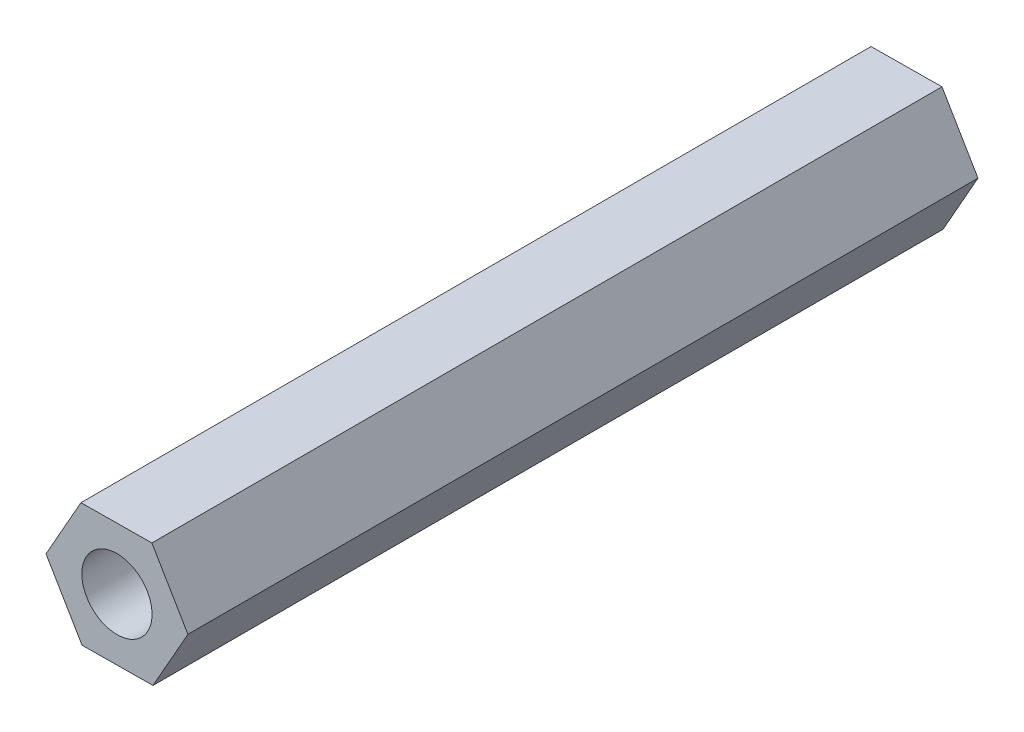
ISO-10303-21;
HEADER;
FILE_DESCRIPTION(('STEP AP214'),'2;1');
FILE_NAME('part.step','',(''),(''),'','','');
FILE_SCHEMA(('AUTOMOTIVE_DESIGN { 1 0 10303 214 1 1 1 1 }'));
ENDSEC;
DATA;
#1=APPLICATION_CONTEXT('core data for automotive mechanical design processes');
#2=APPLICATION_PROTOCOL_DEFINITION('international standard','automotive_design',2000,#1);
#3=PRODUCT_CONTEXT('',#1,'mechanical');
#4=PRODUCT('Part','Part','',(#3));
#5=PRODUCT_RELATED_PRODUCT_CATEGORY('part','',(#4));
#6=PRODUCT_DEFINITION_FORMATION('','',#4);
#7=PRODUCT_DEFINITION_CONTEXT('part definition',#1,'design');
#8=PRODUCT_DEFINITION('design','',#6,#7);
#9=PRODUCT_DEFINITION_SHAPE('','',#8);
#10=(LENGTH_UNIT() NAMED_UNIT(*) SI_UNIT(.MILLI.,.METRE.));
#11=(NAMED_UNIT(*) PLANE_ANGLE_UNIT() SI_UNIT($,.RADIAN.));
#12=(NAMED_UNIT(*) SI_UNIT($,.STERADIAN.) SOLID_ANGLE_UNIT());
#13=UNCERTAINTY_MEASURE_WITH_UNIT(LENGTH_MEASURE(1.E-05),#10,'distance_accuracy_value','');
#14=(GEOMETRIC_REPRESENTATION_CONTEXT(3) GLOBAL_UNCERTAINTY_ASSIGNED_CONTEXT((#13)) GLOBAL_UNIT_ASSIGNED_CONTEXT((#10,
#11,#12)) REPRESENTATION_CONTEXT('',''));
#15=CARTESIAN_POINT('',(0.,0.,0.));
#16=DIRECTION('',(0.,0.,1.));
#17=DIRECTION('',(1.,0.,0.));
#18=AXIS2_PLACEMENT_3D('',#15,#16,#17);
#19=CARTESIAN_POINT('',(0.,0.,45.));
#20=DIRECTION('',(0.,0.,1.));
#21=DIRECTION('',(1.,0.,0.));
#22=AXIS2_PLACEMENT_3D('',#19,#20,#21);
#23=PLANE('',#22);
#24=DIRECTION('',(0.999961257640527,0.00880245522430722,0.));
#25=VECTOR('',#24,1.);
#26=CARTESIAN_POINT('',(-1.98983906118775,-3.51765175136834,45.));
#27=LINE('',#26,#25);
#28=CARTESIAN_POINT('',(-1.98983906118775,-3.51765175136834,45.));
#29=VERTEX_POINT('',#28);
#30=CARTESIAN_POINT('',(2.05145624775792,-3.48207705211536,45.));
#31=VERTEX_POINT('',#30);
#32=EDGE_CURVE('E131',#29,#31,#27,.T.);
#33=ORIENTED_EDGE('',*,*,#32,.T.);
#34=DIRECTION('',(0.492357478980338,0.870393079529086,0.));
#35=VECTOR('',#34,1.);
#36=CARTESIAN_POINT('',(2.05145624775792,-3.48207705211536,45.));
#37=LINE('',#36,#35);
#38=CARTESIAN_POINT('',(4.04129530894568,0.0355746992529791,45.));
#39=VERTEX_POINT('',#38);
#40=EDGE_CURVE('E89',#31,#39,#37,.T.);
#41=ORIENTED_EDGE('',*,*,#40,.T.);
#42=DIRECTION('',(-0.507603778660189,0.861590624304779,0.));
#43=VECTOR('',#42,1.);
#44=CARTESIAN_POINT('',(4.04129530894568,0.0355746992529791,45.));
#45=LINE('',#44,#43);
#46=CARTESIAN_POINT('',(1.98983906118776,3.51765175136834,45.));
#47=VERTEX_POINT('',#46);
#48=EDGE_CURVE('E102',#39,#47,#45,.T.);
#49=ORIENTED_EDGE('',*,*,#48,.T.);
#50=DIRECTION('',(-0.999961257640527,-0.00880245522430723,0.));
#51=VECTOR('',#50,1.);
#52=CARTESIAN_POINT('',(1.98983906118776,3.51765175136834,45.));
#53=LINE('',#52,#51);
#54=CARTESIAN_POINT('',(-2.05145624775791,3.48207705211536,45.));
#55=VERTEX_POINT('',#54);
#56=EDGE_CURVE('E96',#47,#55,#53,.T.);
#57=ORIENTED_EDGE('',*,*,#56,.T.);
#58=DIRECTION('',(-0.492357478980338,-0.870393079529086,0.));
#59=VECTOR('',#58,1.);
#60=CARTESIAN_POINT('',(-2.05145624775791,3.48207705211536,45.));
#61=LINE('',#60,#59);
#62=CARTESIAN_POINT('',(-4.04129530894568,-0.0355746992529825,45.));
#63=VERTEX_POINT('',#62);
#64=EDGE_CURVE('E100',#55,#63,#61,.T.);
#65=ORIENTED_EDGE('',*,*,#64,.T.);
#66=DIRECTION('',(0.507603778660189,-0.861590624304779,0.));
#67=VECTOR('',#66,1.);
#68=CARTESIAN_POINT('',(-4.04129530894568,-0.0355746992529825,45.));
#69=LINE('',#68,#67);
#70=EDGE_CURVE('E52',#63,#29,#69,.T.);
#71=ORIENTED_EDGE('',*,*,#70,.T.);
#72=EDGE_LOOP('',(#33,#41,#49,#57,#65,#71));
#73=FACE_BOUND('',#72,.T.);
#74=CARTESIAN_POINT('',(0.,0.,45.));
#75=DIRECTION('',(0.,0.,1.));
#76=DIRECTION('',(1.,0.,0.));
#77=AXIS2_PLACEMENT_3D('',#74,#75,#76);
#78=CIRCLE('',#77,2.);
#79=CARTESIAN_POINT('',(-2.,0.,45.));
#80=VERTEX_POINT('',#79);
#81=EDGE_CURVE('E124',#80,#80,#78,.T.);
#82=ORIENTED_EDGE('',*,*,#81,.F.);
#83=EDGE_LOOP('',(#82));
#84=FACE_BOUND('',#83,.T.);
#85=ADVANCED_FACE('F35',(#73,#84),#23,.T.);
#86=CARTESIAN_POINT('',(0.,0.,0.));
#87=DIRECTION('',(0.,0.,1.));
#88=DIRECTION('',(1.,0.,0.));
#89=AXIS2_PLACEMENT_3D('',#86,#87,#88);
#90=PLANE('',#89);
#91=DIRECTION('',(0.999961257640527,0.00880245522430722,0.));
#92=VECTOR('',#91,1.);
#93=CARTESIAN_POINT('',(-1.98983906118775,-3.51765175136834,0.));
#94=LINE('',#93,#92);
#95=CARTESIAN_POINT('',(-1.98983906118775,-3.51765175136834,0.));
#96=VERTEX_POINT('',#95);
#97=CARTESIAN_POINT('',(2.05145624775792,-3.48207705211536,0.));
#98=VERTEX_POINT('',#97);
#99=EDGE_CURVE('E120',#96,#98,#94,.T.);
#100=ORIENTED_EDGE('',*,*,#99,.F.);
#101=DIRECTION('',(0.507603778660189,-0.861590624304779,0.));
#102=VECTOR('',#101,1.);
#103=CARTESIAN_POINT('',(-4.04129530894568,-0.0355746992529825,0.));
#104=LINE('',#103,#102);
#105=CARTESIAN_POINT('',(-4.04129530894568,-0.0355746992529825,0.));
#106=VERTEX_POINT('',#105);
#107=EDGE_CURVE('E81',#106,#96,#104,.T.);
#108=ORIENTED_EDGE('',*,*,#107,.F.);
#109=DIRECTION('',(-0.492357478980338,-0.870393079529086,0.));
#110=VECTOR('',#109,1.);
#111=CARTESIAN_POINT('',(-2.05145624775791,3.48207705211536,0.));
#112=LINE('',#111,#110);
#113=CARTESIAN_POINT('',(-2.05145624775791,3.48207705211536,0.));
#114=VERTEX_POINT('',#113);
#115=EDGE_CURVE('E75',#114,#106,#112,.T.);
#116=ORIENTED_EDGE('',*,*,#115,.F.);
#117=DIRECTION('',(-0.999961257640527,-0.00880245522430723,0.));
#118=VECTOR('',#117,1.);
#119=CARTESIAN_POINT('',(1.98983906118776,3.51765175136834,0.));
#120=LINE('',#119,#118);
#121=CARTESIAN_POINT('',(1.98983906118776,3.51765175136834,0.));
#122=VERTEX_POINT('',#121);
#123=EDGE_CURVE('E110',#122,#114,#120,.T.);
#124=ORIENTED_EDGE('',*,*,#123,.F.);
#125=DIRECTION('',(-0.507603778660189,0.861590624304779,0.));
#126=VECTOR('',#125,1.);
#127=CARTESIAN_POINT('',(4.04129530894568,0.0355746992529791,0.));
#128=LINE('',#127,#126);
#129=CARTESIAN_POINT('',(4.04129530894568,0.0355746992529791,0.));
#130=VERTEX_POINT('',#129);
#131=EDGE_CURVE('E126',#130,#122,#128,.T.);
#132=ORIENTED_EDGE('',*,*,#131,.F.);
#133=DIRECTION('',(0.492357478980338,0.870393079529086,0.));
#134=VECTOR('',#133,1.);
#135=CARTESIAN_POINT('',(2.05145624775792,-3.48207705211536,0.));
#136=LINE('',#135,#134);
#137=EDGE_CURVE('E123',#98,#130,#136,.T.);
#138=ORIENTED_EDGE('',*,*,#137,.F.);
#139=EDGE_LOOP('',(#100,#108,#116,#124,#132,#138));
#140=FACE_BOUND('',#139,.T.);
#141=CARTESIAN_POINT('',(0.,0.,0.));
#142=DIRECTION('',(0.,0.,1.));
#143=DIRECTION('',(1.,0.,0.));
#144=AXIS2_PLACEMENT_3D('',#141,#142,#143);
#145=CIRCLE('',#144,2.);
#146=CARTESIAN_POINT('',(-2.,0.,0.));
#147=VERTEX_POINT('',#146);
#148=EDGE_CURVE('E224',#147,#147,#145,.T.);
#149=ORIENTED_EDGE('',*,*,#148,.T.);
#150=EDGE_LOOP('',(#149));
#151=FACE_BOUND('',#150,.T.);
#152=ADVANCED_FACE('F140',(#140,#151),#90,.F.);
#153=CARTESIAN_POINT('',(-1.98983906118775,-3.51765175136834,45.));
#154=DIRECTION('',(-0.00880245522430722,0.999961257640527,0.));
#155=DIRECTION('',(-0.999961257640527,-0.00880245522430722,0.));
#156=AXIS2_PLACEMENT_3D('',#153,#154,#155);
#157=PLANE('',#156);
#158=ORIENTED_EDGE('',*,*,#99,.T.);
#159=DIRECTION('',(0.,0.,-1.));
#160=VECTOR('',#159,1.);
#161=CARTESIAN_POINT('',(2.05145624775792,-3.48207705211536,45.));
#162=LINE('',#161,#160);
#163=EDGE_CURVE('E11',#31,#98,#162,.T.);
#164=ORIENTED_EDGE('',*,*,#163,.F.);
#165=ORIENTED_EDGE('',*,*,#32,.F.);
#166=DIRECTION('',(0.,0.,-1.));
#167=VECTOR('',#166,1.);
#168=CARTESIAN_POINT('',(-1.98983906118775,-3.51765175136834,45.));
#169=LINE('',#168,#167);
#170=EDGE_CURVE('E116',#29,#96,#169,.T.);
#171=ORIENTED_EDGE('',*,*,#170,.T.);
#172=EDGE_LOOP('',(#158,#164,#165,#171));
#173=FACE_BOUND('',#172,.T.);
#174=ADVANCED_FACE('F37',(#173),#157,.F.);
#175=CARTESIAN_POINT('',(2.05145624775792,-3.48207705211536,45.));
#176=DIRECTION('',(-0.870393079529086,0.492357478980338,0.));
#177=DIRECTION('',(-0.492357478980338,-0.870393079529086,0.));
#178=AXIS2_PLACEMENT_3D('',#175,#176,#177);
#179=PLANE('',#178);
#180=ORIENTED_EDGE('',*,*,#137,.T.);
#181=DIRECTION('',(0.,0.,-1.));
#182=VECTOR('',#181,1.);
#183=CARTESIAN_POINT('',(4.04129530894568,0.0355746992529791,45.));
#184=LINE('',#183,#182);
#185=EDGE_CURVE('E44',#39,#130,#184,.T.);
#186=ORIENTED_EDGE('',*,*,#185,.F.);
#187=ORIENTED_EDGE('',*,*,#40,.F.);
#188=ORIENTED_EDGE('',*,*,#163,.T.);
#189=EDGE_LOOP('',(#180,#186,#187,#188));
#190=FACE_BOUND('',#189,.T.);
#191=ADVANCED_FACE('F165',(#190),#179,.F.);
#192=CARTESIAN_POINT('',(4.04129530894568,0.0355746992529791,45.));
#193=DIRECTION('',(-0.861590624304778,-0.507603778660189,0.));
#194=DIRECTION('',(0.507603778660189,-0.861590624304779,0.));
#195=AXIS2_PLACEMENT_3D('',#192,#193,#194);
#196=PLANE('',#195);
#197=ORIENTED_EDGE('',*,*,#131,.T.);
#198=DIRECTION('',(0.,0.,-1.));
#199=VECTOR('',#198,1.);
#200=CARTESIAN_POINT('',(1.98983906118776,3.51765175136834,45.));
#201=LINE('',#200,#199);
#202=EDGE_CURVE('E111',#47,#122,#201,.T.);
#203=ORIENTED_EDGE('',*,*,#202,.F.);
#204=ORIENTED_EDGE('',*,*,#48,.F.);
#205=ORIENTED_EDGE('',*,*,#185,.T.);
#206=EDGE_LOOP('',(#197,#203,#204,#205));
#207=FACE_BOUND('',#206,.T.);
#208=ADVANCED_FACE('F137',(#207),#196,.F.);
#209=CARTESIAN_POINT('',(1.98983906118776,3.51765175136834,45.));
#210=DIRECTION('',(0.00880245522430723,-0.999961257640527,0.));
#211=DIRECTION('',(0.999961257640527,0.00880245522430723,0.));
#212=AXIS2_PLACEMENT_3D('',#209,#210,#211);
#213=PLANE('',#212);
#214=ORIENTED_EDGE('',*,*,#123,.T.);
#215=DIRECTION('',(0.,0.,-1.));
#216=VECTOR('',#215,1.);
#217=CARTESIAN_POINT('',(-2.05145624775791,3.48207705211536,45.));
#218=LINE('',#217,#216);
#219=EDGE_CURVE('E107',#55,#114,#218,.T.);
#220=ORIENTED_EDGE('',*,*,#219,.F.);
#221=ORIENTED_EDGE('',*,*,#56,.F.);
#222=ORIENTED_EDGE('',*,*,#202,.T.);
#223=EDGE_LOOP('',(#214,#220,#221,#222));
#224=FACE_BOUND('',#223,.T.);
#225=ADVANCED_FACE('F108',(#224),#213,.F.);
#226=CARTESIAN_POINT('',(-2.05145624775791,3.48207705211536,45.));
#227=DIRECTION('',(0.870393079529086,-0.492357478980338,0.));
#228=DIRECTION('',(0.492357478980338,0.870393079529086,0.));
#229=AXIS2_PLACEMENT_3D('',#226,#227,#228);
#230=PLANE('',#229);
#231=ORIENTED_EDGE('',*,*,#115,.T.);
#232=DIRECTION('',(0.,0.,-1.));
#233=VECTOR('',#232,1.);
#234=CARTESIAN_POINT('',(-4.04129530894568,-0.0355746992529825,45.));
#235=LINE('',#234,#233);
#236=EDGE_CURVE('E112',#63,#106,#235,.T.);
#237=ORIENTED_EDGE('',*,*,#236,.F.);
#238=ORIENTED_EDGE('',*,*,#64,.F.);
#239=ORIENTED_EDGE('',*,*,#219,.T.);
#240=EDGE_LOOP('',(#231,#237,#238,#239));
#241=FACE_BOUND('',#240,.T.);
#242=ADVANCED_FACE('F114',(#241),#230,.F.);
#243=CARTESIAN_POINT('',(-4.04129530894568,-0.0355746992529825,45.));
#244=DIRECTION('',(0.861590624304779,0.507603778660189,0.));
#245=DIRECTION('',(-0.507603778660189,0.861590624304779,0.));
#246=AXIS2_PLACEMENT_3D('',#243,#244,#245);
#247=PLANE('',#246);
#248=ORIENTED_EDGE('',*,*,#107,.T.);
#249=ORIENTED_EDGE('',*,*,#170,.F.);
#250=ORIENTED_EDGE('',*,*,#70,.F.);
#251=ORIENTED_EDGE('',*,*,#236,.T.);
#252=EDGE_LOOP('',(#248,#249,#250,#251));
#253=FACE_BOUND('',#252,.T.);
#254=ADVANCED_FACE('F145',(#253),#247,.F.);
#255=CARTESIAN_POINT('',(0.,0.,45.));
#256=DIRECTION('',(0.,0.,-1.));
#257=DIRECTION('',(-1.,0.,0.));
#258=AXIS2_PLACEMENT_3D('',#255,#256,#257);
#259=CYLINDRICAL_SURFACE('',#258,2.);
#260=CARTESIAN_POINT('',(-2.,0.,45.));
#261=CARTESIAN_POINT('',(-2.,0.,44.53125));
#262=CARTESIAN_POINT('',(-2.,0.,44.0625));
#263=CARTESIAN_POINT('',(-2.,0.,43.125));
#264=CARTESIAN_POINT('',(-2.,0.,42.65625));
#265=CARTESIAN_POINT('',(-2.,0.,41.71875));
#266=CARTESIAN_POINT('',(-2.,0.,41.25));
#267=CARTESIAN_POINT('',(-2.,0.,40.3125));
#268=CARTESIAN_POINT('',(-2.,0.,39.84375));
#269=CARTESIAN_POINT('',(-2.,0.,38.90625));
#270=CARTESIAN_POINT('',(-2.,0.,38.4375));
#271=CARTESIAN_POINT('',(-2.,0.,37.5));
#272=CARTESIAN_POINT('',(-2.,0.,37.03125));
#273=CARTESIAN_POINT('',(-2.,0.,36.09375));
#274=CARTESIAN_POINT('',(-2.,0.,35.625));
#275=CARTESIAN_POINT('',(-2.,0.,34.6875));
#276=CARTESIAN_POINT('',(-2.,0.,34.21875));
#277=CARTESIAN_POINT('',(-2.,0.,33.28125));
#278=CARTESIAN_POINT('',(-2.,0.,32.8125));
#279=CARTESIAN_POINT('',(-2.,0.,31.875));
#280=CARTESIAN_POINT('',(-2.,0.,31.40625));
#281=CARTESIAN_POINT('',(-2.,0.,30.46875));
#282=CARTESIAN_POINT('',(-2.,0.,30.));
#283=CARTESIAN_POINT('',(-2.,0.,29.0625));
#284=CARTESIAN_POINT('',(-2.,0.,28.59375));
#285=CARTESIAN_POINT('',(-2.,0.,27.65625));
#286=CARTESIAN_POINT('',(-2.,0.,27.1875));
#287=CARTESIAN_POINT('',(-2.,0.,26.25));
#288=CARTESIAN_POINT('',(-2.,0.,25.78125));
#289=CARTESIAN_POINT('',(-2.,0.,24.84375));
#290=CARTESIAN_POINT('',(-2.,0.,24.375));
#291=CARTESIAN_POINT('',(-2.,0.,23.4375));
#292=CARTESIAN_POINT('',(-2.,0.,22.96875));
#293=CARTESIAN_POINT('',(-2.,0.,22.03125));
#294=CARTESIAN_POINT('',(-2.,0.,21.5625));
#295=CARTESIAN_POINT('',(-2.,0.,20.625));
#296=CARTESIAN_POINT('',(-2.,0.,20.15625));
#297=CARTESIAN_POINT('',(-2.,0.,19.21875));
#298=CARTESIAN_POINT('',(-2.,0.,18.75));
#299=CARTESIAN_POINT('',(-2.,0.,17.8125));
#300=CARTESIAN_POINT('',(-2.,0.,17.34375));
#301=CARTESIAN_POINT('',(-2.,0.,16.40625));
#302=CARTESIAN_POINT('',(-2.,0.,15.9375));
#303=CARTESIAN_POINT('',(-2.,0.,15.));
#304=CARTESIAN_POINT('',(-2.,0.,14.53125));
#305=CARTESIAN_POINT('',(-2.,0.,13.59375));
#306=CARTESIAN_POINT('',(-2.,0.,13.125));
#307=CARTESIAN_POINT('',(-2.,0.,12.1875));
#308=CARTESIAN_POINT('',(-2.,0.,11.71875));
#309=CARTESIAN_POINT('',(-2.,0.,10.78125));
#310=CARTESIAN_POINT('',(-2.,0.,10.3125));
#311=CARTESIAN_POINT('',(-2.,0.,9.37499999999999));
#312=CARTESIAN_POINT('',(-2.,0.,8.90624999999999));
#313=CARTESIAN_POINT('',(-2.,0.,7.96874999999999));
#314=CARTESIAN_POINT('',(-2.,0.,7.5));
#315=CARTESIAN_POINT('',(-2.,0.,6.56249999999999));
#316=CARTESIAN_POINT('',(-2.,0.,6.09374999999999));
#317=CARTESIAN_POINT('',(-2.,0.,5.15624999999999));
#318=CARTESIAN_POINT('',(-2.,0.,4.68749999999999));
#319=CARTESIAN_POINT('',(-2.,0.,3.74999999999999));
#320=CARTESIAN_POINT('',(-2.,0.,3.28124999999999));
#321=CARTESIAN_POINT('',(-2.,0.,2.34374999999999));
#322=CARTESIAN_POINT('',(-2.,0.,1.87499999999999));
#323=CARTESIAN_POINT('',(-2.,0.,0.937499999999992));
#324=CARTESIAN_POINT('',(-2.,0.,0.468749999999993));
#325=CARTESIAN_POINT('',(-2.,0.,0.));
#326=B_SPLINE_CURVE_WITH_KNOTS('',3,(#260,#261,#262,#263,#264,#265,#266,#267,#268,#269,#270,
#271,#272,#273,#274,#275,#276,#277,#278,#279,#280,#281,#282,#283,#284,#285,#286,#287,#288,#289,
#290,#291,#292,#293,#294,#295,#296,#297,#298,#299,#300,#301,#302,#303,#304,#305,#306,#307,#308,
#309,#310,#311,#312,#313,#314,#315,#316,#317,#318,#319,#320,#321,#322,#323,#324,#325),
.UNSPECIFIED.,.F.,.F.,(4,2,2,2,2,2,2,2,2,2,2,2,2,2,2,2,2,2,2,2,2,2,2,2,2,2,2,2,2,2,2,2,4),(0.,
1.40625,2.8125,4.21874999999999,5.625,7.03125,8.43749999999999,9.84375,11.25,12.65625,14.0625,
15.46875,16.875,18.28125,19.6875,21.09375,22.5,23.90625,25.3125,26.71875,28.125,29.53125,
30.9375,32.34375,33.75,35.15625,36.5625,37.96875,39.375,40.78125,42.1875,43.59375,45.),.UNSPECIFIED.);
#327=EDGE_CURVE('BSEAM147',#80,#147,#326,.T.);
#328=ORIENTED_EDGE('',*,*,#81,.T.);
#329=ORIENTED_EDGE('',*,*,#148,.F.);
#330=ORIENTED_EDGE('',*,*,#327,.T.);
#331=ORIENTED_EDGE('',*,*,#327,.F.);
#332=EDGE_LOOP('',(#328,#330,#329,#331));
#333=FACE_BOUND('',#332,.T.);
#334=ADVANCED_FACE('F147',(#333),#259,.F.);
#335=CLOSED_SHELL('',(#85,#152,#174,#191,#208,#225,#242,#254,#334));
#336=MANIFOLD_SOLID_BREP('B2',#335);
#337=ADVANCED_BREP_SHAPE_REPRESENTATION('',(#18,#336),#14);
#338=SHAPE_DEFINITION_REPRESENTATION(#9,#337);
ENDSEC;
END-ISO-10303-21;
